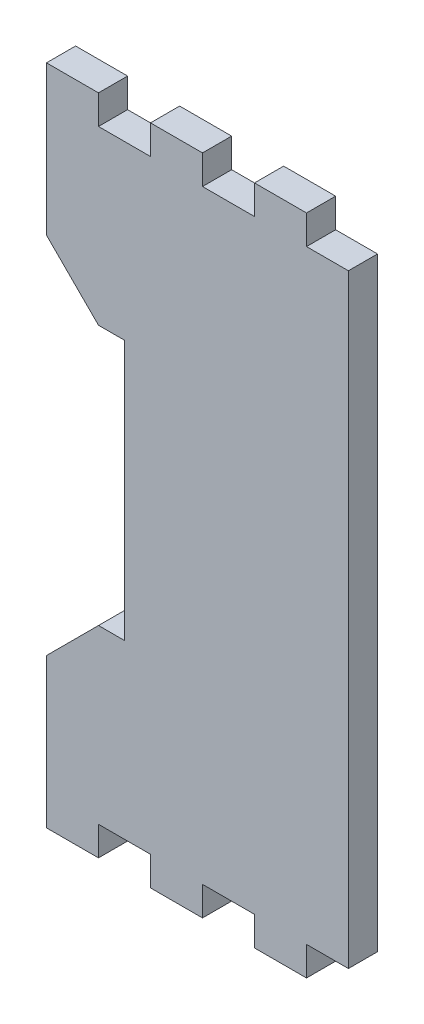
ISO-10303-21;
HEADER;
FILE_DESCRIPTION(('STEP AP214'),'2;1');
FILE_NAME('part.step','',(''),(''),'','','');
FILE_SCHEMA(('AUTOMOTIVE_DESIGN { 1 0 10303 214 1 1 1 1 }'));
ENDSEC;
DATA;
#1=APPLICATION_CONTEXT('core data for automotive mechanical design processes');
#2=APPLICATION_PROTOCOL_DEFINITION('international standard','automotive_design',2000,#1);
#3=PRODUCT_CONTEXT('',#1,'mechanical');
#4=PRODUCT('Part','Part','',(#3));
#5=PRODUCT_RELATED_PRODUCT_CATEGORY('part','',(#4));
#6=PRODUCT_DEFINITION_FORMATION('','',#4);
#7=PRODUCT_DEFINITION_CONTEXT('part definition',#1,'design');
#8=PRODUCT_DEFINITION('design','',#6,#7);
#9=PRODUCT_DEFINITION_SHAPE('','',#8);
#10=(LENGTH_UNIT() NAMED_UNIT(*) SI_UNIT(.MILLI.,.METRE.));
#11=(NAMED_UNIT(*) PLANE_ANGLE_UNIT() SI_UNIT($,.RADIAN.));
#12=(NAMED_UNIT(*) SI_UNIT($,.STERADIAN.) SOLID_ANGLE_UNIT());
#13=UNCERTAINTY_MEASURE_WITH_UNIT(LENGTH_MEASURE(1.E-05),#10,'distance_accuracy_value','');
#14=(GEOMETRIC_REPRESENTATION_CONTEXT(3) GLOBAL_UNCERTAINTY_ASSIGNED_CONTEXT((#13)) GLOBAL_UNIT_ASSIGNED_CONTEXT((#10,
#11,#12)) REPRESENTATION_CONTEXT('',''));
#15=CARTESIAN_POINT('',(0.,0.,0.));
#16=DIRECTION('',(0.,0.,1.));
#17=DIRECTION('',(1.,0.,0.));
#18=AXIS2_PLACEMENT_3D('',#15,#16,#17);
#19=CARTESIAN_POINT('',(71.2512678289992,129.093154424768,-71.1104050028954));
#20=DIRECTION('',(1.,0.,0.));
#21=DIRECTION('',(0.,1.,0.));
#22=AXIS2_PLACEMENT_3D('',#19,#20,#21);
#23=PLANE('',#22);
#24=DIRECTION('',(0.,-1.,0.));
#25=VECTOR('',#24,1.);
#26=CARTESIAN_POINT('',(71.2512678289992,129.093154424768,-76.7104050028954));
#27=LINE('',#26,#25);
#28=CARTESIAN_POINT('',(71.2512678289992,134.693154424768,-76.7104050028954));
#29=VERTEX_POINT('',#28);
#30=CARTESIAN_POINT('',(71.2512678289992,105.993154424768,-76.7104050028954));
#31=VERTEX_POINT('',#30);
#32=EDGE_CURVE('E151',#29,#31,#27,.T.);
#33=ORIENTED_EDGE('',*,*,#32,.T.);
#34=DIRECTION('',(0.,0.,-1.));
#35=VECTOR('',#34,1.);
#36=CARTESIAN_POINT('',(71.2512678289992,105.993154424768,-71.1104050028954));
#37=LINE('',#36,#35);
#38=CARTESIAN_POINT('',(71.2512678289992,105.993154424768,-71.1104050028954));
#39=VERTEX_POINT('',#38);
#40=EDGE_CURVE('E11',#39,#31,#37,.T.);
#41=ORIENTED_EDGE('',*,*,#40,.F.);
#42=DIRECTION('',(0.,-1.,0.));
#43=VECTOR('',#42,1.);
#44=CARTESIAN_POINT('',(71.2512678289992,134.693154424768,-71.1104050028954));
#45=LINE('',#44,#43);
#46=CARTESIAN_POINT('',(71.2512678289992,134.693154424768,-71.1104050028954));
#47=VERTEX_POINT('',#46);
#48=EDGE_CURVE('E157',#47,#39,#45,.T.);
#49=ORIENTED_EDGE('',*,*,#48,.F.);
#50=DIRECTION('',(0.,0.,-1.));
#51=VECTOR('',#50,1.);
#52=CARTESIAN_POINT('',(71.2512678289992,134.693154424768,-71.1104050028954));
#53=LINE('',#52,#51);
#54=EDGE_CURVE('E257',#47,#29,#53,.T.);
#55=ORIENTED_EDGE('',*,*,#54,.T.);
#56=EDGE_LOOP('',(#33,#41,#49,#55));
#57=FACE_BOUND('',#56,.T.);
#58=ADVANCED_FACE('F33',(#57),#23,.F.);
#59=CARTESIAN_POINT('',(71.2512678289992,105.993154424768,-71.1104050028954));
#60=DIRECTION('',(0.707106781186549,0.707106781186546,0.));
#61=DIRECTION('',(-0.707106781186546,0.707106781186549,0.));
#62=AXIS2_PLACEMENT_3D('',#59,#60,#61);
#63=PLANE('',#62);
#64=DIRECTION('',(0.707106781186546,-0.707106781186549,0.));
#65=VECTOR('',#64,1.);
#66=CARTESIAN_POINT('',(71.2512678289992,105.993154424768,-76.7104050028954));
#67=LINE('',#66,#65);
#68=CARTESIAN_POINT('',(81.2512678289992,95.9931544247676,-76.7104050028954));
#69=VERTEX_POINT('',#68);
#70=EDGE_CURVE('E262',#31,#69,#67,.T.);
#71=ORIENTED_EDGE('',*,*,#70,.T.);
#72=DIRECTION('',(0.,0.,-1.));
#73=VECTOR('',#72,1.);
#74=CARTESIAN_POINT('',(81.2512678289992,95.9931544247676,-71.1104050028954));
#75=LINE('',#74,#73);
#76=CARTESIAN_POINT('',(81.2512678289992,95.9931544247676,-71.1104050028954));
#77=VERTEX_POINT('',#76);
#78=EDGE_CURVE('E41',#77,#69,#75,.T.);
#79=ORIENTED_EDGE('',*,*,#78,.F.);
#80=DIRECTION('',(0.707106781186546,-0.707106781186549,0.));
#81=VECTOR('',#80,1.);
#82=CARTESIAN_POINT('',(71.2512678289992,105.993154424768,-71.1104050028954));
#83=LINE('',#82,#81);
#84=EDGE_CURVE('E477',#39,#77,#83,.T.);
#85=ORIENTED_EDGE('',*,*,#84,.F.);
#86=ORIENTED_EDGE('',*,*,#40,.T.);
#87=EDGE_LOOP('',(#71,#79,#85,#86));
#88=FACE_BOUND('',#87,.T.);
#89=ADVANCED_FACE('F480',(#88),#63,.F.);
#90=CARTESIAN_POINT('',(81.2512678289992,95.9931544247676,-71.1104050028954));
#91=DIRECTION('',(0.,1.,0.));
#92=DIRECTION('',(0.,0.,1.));
#93=AXIS2_PLACEMENT_3D('',#90,#91,#92);
#94=PLANE('',#93);
#95=DIRECTION('',(1.,0.,0.));
#96=VECTOR('',#95,1.);
#97=CARTESIAN_POINT('',(81.2512678289992,95.9931544247676,-76.7104050028954));
#98=LINE('',#97,#96);
#99=CARTESIAN_POINT('',(86.2512678289992,95.9931544247676,-76.7104050028954));
#100=VERTEX_POINT('',#99);
#101=EDGE_CURVE('E264',#69,#100,#98,.T.);
#102=ORIENTED_EDGE('',*,*,#101,.T.);
#103=DIRECTION('',(0.,0.,-1.));
#104=VECTOR('',#103,1.);
#105=CARTESIAN_POINT('',(86.2512678289992,95.9931544247676,-71.1104050028954));
#106=LINE('',#105,#104);
#107=CARTESIAN_POINT('',(86.2512678289992,95.9931544247676,-71.1104050028954));
#108=VERTEX_POINT('',#107);
#109=EDGE_CURVE('E392',#108,#100,#106,.T.);
#110=ORIENTED_EDGE('',*,*,#109,.F.);
#111=DIRECTION('',(1.,0.,0.));
#112=VECTOR('',#111,1.);
#113=CARTESIAN_POINT('',(81.2512678289992,95.9931544247676,-71.1104050028954));
#114=LINE('',#113,#112);
#115=EDGE_CURVE('E401',#77,#108,#114,.T.);
#116=ORIENTED_EDGE('',*,*,#115,.F.);
#117=ORIENTED_EDGE('',*,*,#78,.T.);
#118=EDGE_LOOP('',(#102,#110,#116,#117));
#119=FACE_BOUND('',#118,.T.);
#120=ADVANCED_FACE('F399',(#119),#94,.F.);
#121=CARTESIAN_POINT('',(86.2512678289992,95.9931544247676,-71.1104050028954));
#122=DIRECTION('',(1.,0.,0.));
#123=DIRECTION('',(0.,0.,-1.));
#124=AXIS2_PLACEMENT_3D('',#121,#122,#123);
#125=PLANE('',#124);
#126=DIRECTION('',(0.,-1.,0.));
#127=VECTOR('',#126,1.);
#128=CARTESIAN_POINT('',(86.2512678289992,95.9931544247676,-76.7104050028954));
#129=LINE('',#128,#127);
#130=CARTESIAN_POINT('',(86.2512678289992,45.9931544247676,-76.7104050028954));
#131=VERTEX_POINT('',#130);
#132=EDGE_CURVE('E266',#100,#131,#129,.T.);
#133=ORIENTED_EDGE('',*,*,#132,.T.);
#134=DIRECTION('',(0.,0.,-1.));
#135=VECTOR('',#134,1.);
#136=CARTESIAN_POINT('',(86.2512678289992,45.9931544247676,-71.1104050028954));
#137=LINE('',#136,#135);
#138=CARTESIAN_POINT('',(86.2512678289992,45.9931544247676,-71.1104050028954));
#139=VERTEX_POINT('',#138);
#140=EDGE_CURVE('E389',#139,#131,#137,.T.);
#141=ORIENTED_EDGE('',*,*,#140,.F.);
#142=DIRECTION('',(0.,-1.,0.));
#143=VECTOR('',#142,1.);
#144=CARTESIAN_POINT('',(86.2512678289992,95.9931544247676,-71.1104050028954));
#145=LINE('',#144,#143);
#146=EDGE_CURVE('E419',#108,#139,#145,.T.);
#147=ORIENTED_EDGE('',*,*,#146,.F.);
#148=ORIENTED_EDGE('',*,*,#109,.T.);
#149=EDGE_LOOP('',(#133,#141,#147,#148));
#150=FACE_BOUND('',#149,.T.);
#151=ADVANCED_FACE('F410',(#150),#125,.F.);
#152=CARTESIAN_POINT('',(86.2512678289992,45.9931544247676,-71.1104050028954));
#153=DIRECTION('',(0.,-1.,0.));
#154=DIRECTION('',(0.,0.,-1.));
#155=AXIS2_PLACEMENT_3D('',#152,#153,#154);
#156=PLANE('',#155);
#157=DIRECTION('',(-1.,0.,0.));
#158=VECTOR('',#157,1.);
#159=CARTESIAN_POINT('',(86.2512678289992,45.9931544247676,-76.7104050028954));
#160=LINE('',#159,#158);
#161=CARTESIAN_POINT('',(81.2512678289992,45.9931544247676,-76.7104050028954));
#162=VERTEX_POINT('',#161);
#163=EDGE_CURVE('E268',#131,#162,#160,.T.);
#164=ORIENTED_EDGE('',*,*,#163,.T.);
#165=DIRECTION('',(0.,0.,-1.));
#166=VECTOR('',#165,1.);
#167=CARTESIAN_POINT('',(81.2512678289992,45.9931544247676,-71.1104050028954));
#168=LINE('',#167,#166);
#169=CARTESIAN_POINT('',(81.2512678289992,45.9931544247676,-71.1104050028954));
#170=VERTEX_POINT('',#169);
#171=EDGE_CURVE('E386',#170,#162,#168,.T.);
#172=ORIENTED_EDGE('',*,*,#171,.F.);
#173=DIRECTION('',(-1.,0.,0.));
#174=VECTOR('',#173,1.);
#175=CARTESIAN_POINT('',(86.2512678289992,45.9931544247676,-71.1104050028954));
#176=LINE('',#175,#174);
#177=EDGE_CURVE('E416',#139,#170,#176,.T.);
#178=ORIENTED_EDGE('',*,*,#177,.F.);
#179=ORIENTED_EDGE('',*,*,#140,.T.);
#180=EDGE_LOOP('',(#164,#172,#178,#179));
#181=FACE_BOUND('',#180,.T.);
#182=ADVANCED_FACE('F414',(#181),#156,.F.);
#183=CARTESIAN_POINT('',(81.2512678289992,45.9931544247676,-71.1104050028954));
#184=DIRECTION('',(0.707106781186549,-0.707106781186546,0.));
#185=DIRECTION('',(0.707106781186546,0.707106781186549,0.));
#186=AXIS2_PLACEMENT_3D('',#183,#184,#185);
#187=PLANE('',#186);
#188=DIRECTION('',(-0.707106781186546,-0.707106781186549,0.));
#189=VECTOR('',#188,1.);
#190=CARTESIAN_POINT('',(81.2512678289992,45.9931544247676,-76.7104050028954));
#191=LINE('',#190,#189);
#192=CARTESIAN_POINT('',(71.2512678289992,35.9931544247676,-76.7104050028954));
#193=VERTEX_POINT('',#192);
#194=EDGE_CURVE('E270',#162,#193,#191,.T.);
#195=ORIENTED_EDGE('',*,*,#194,.T.);
#196=DIRECTION('',(0.,0.,-1.));
#197=VECTOR('',#196,1.);
#198=CARTESIAN_POINT('',(71.2512678289992,35.9931544247676,-71.1104050028954));
#199=LINE('',#198,#197);
#200=CARTESIAN_POINT('',(71.2512678289992,35.9931544247676,-71.1104050028954));
#201=VERTEX_POINT('',#200);
#202=EDGE_CURVE('E383',#201,#193,#199,.T.);
#203=ORIENTED_EDGE('',*,*,#202,.F.);
#204=DIRECTION('',(-0.707106781186546,-0.707106781186549,0.));
#205=VECTOR('',#204,1.);
#206=CARTESIAN_POINT('',(81.2512678289992,45.9931544247676,-71.1104050028954));
#207=LINE('',#206,#205);
#208=EDGE_CURVE('E418',#170,#201,#207,.T.);
#209=ORIENTED_EDGE('',*,*,#208,.F.);
#210=ORIENTED_EDGE('',*,*,#171,.T.);
#211=EDGE_LOOP('',(#195,#203,#209,#210));
#212=FACE_BOUND('',#211,.T.);
#213=ADVANCED_FACE('F492',(#212),#187,.F.);
#214=CARTESIAN_POINT('',(71.2512678289992,12.8931544247676,-71.1104050028954));
#215=DIRECTION('',(1.,0.,0.));
#216=DIRECTION('',(0.,0.,-1.));
#217=AXIS2_PLACEMENT_3D('',#214,#215,#216);
#218=PLANE('',#217);
#219=DIRECTION('',(0.,-1.,0.));
#220=VECTOR('',#219,1.);
#221=CARTESIAN_POINT('',(71.2512678289992,12.8931544247676,-76.7104050028954));
#222=LINE('',#221,#220);
#223=CARTESIAN_POINT('',(71.2512678289992,7.29315442476763,-76.7104050028954));
#224=VERTEX_POINT('',#223);
#225=EDGE_CURVE('E273',#193,#224,#222,.T.);
#226=ORIENTED_EDGE('',*,*,#225,.T.);
#227=DIRECTION('',(0.,0.,-1.));
#228=VECTOR('',#227,1.);
#229=CARTESIAN_POINT('',(71.2512678289992,7.29315442476763,-71.1104050028954));
#230=LINE('',#229,#228);
#231=CARTESIAN_POINT('',(71.2512678289992,7.29315442476763,-71.1104050028954));
#232=VERTEX_POINT('',#231);
#233=EDGE_CURVE('E380',#232,#224,#230,.T.);
#234=ORIENTED_EDGE('',*,*,#233,.F.);
#235=DIRECTION('',(0.,-1.,0.));
#236=VECTOR('',#235,1.);
#237=CARTESIAN_POINT('',(71.2512678289992,35.9931544247676,-71.1104050028954));
#238=LINE('',#237,#236);
#239=EDGE_CURVE('E421',#201,#232,#238,.T.);
#240=ORIENTED_EDGE('',*,*,#239,.F.);
#241=ORIENTED_EDGE('',*,*,#202,.T.);
#242=EDGE_LOOP('',(#226,#234,#240,#241));
#243=FACE_BOUND('',#242,.T.);
#244=ADVANCED_FACE('F495',(#243),#218,.F.);
#245=CARTESIAN_POINT('',(71.2512678289992,7.29315442476763,-71.1104050028954));
#246=DIRECTION('',(0.,1.,0.));
#247=DIRECTION('',(0.,0.,1.));
#248=AXIS2_PLACEMENT_3D('',#245,#246,#247);
#249=PLANE('',#248);
#250=DIRECTION('',(1.,0.,0.));
#251=VECTOR('',#250,1.);
#252=CARTESIAN_POINT('',(71.2512678289992,7.29315442476763,-76.7104050028954));
#253=LINE('',#252,#251);
#254=CARTESIAN_POINT('',(81.2512678289992,7.29315442476763,-76.7104050028954));
#255=VERTEX_POINT('',#254);
#256=EDGE_CURVE('E275',#224,#255,#253,.T.);
#257=ORIENTED_EDGE('',*,*,#256,.T.);
#258=DIRECTION('',(0.,0.,-1.));
#259=VECTOR('',#258,1.);
#260=CARTESIAN_POINT('',(81.2512678289992,7.29315442476763,-71.1104050028954));
#261=LINE('',#260,#259);
#262=CARTESIAN_POINT('',(81.2512678289992,7.29315442476763,-71.1104050028954));
#263=VERTEX_POINT('',#262);
#264=EDGE_CURVE('E377',#263,#255,#261,.T.);
#265=ORIENTED_EDGE('',*,*,#264,.F.);
#266=DIRECTION('',(1.,0.,0.));
#267=VECTOR('',#266,1.);
#268=CARTESIAN_POINT('',(71.2512678289992,7.29315442476763,-71.1104050028954));
#269=LINE('',#268,#267);
#270=EDGE_CURVE('E427',#232,#263,#269,.T.);
#271=ORIENTED_EDGE('',*,*,#270,.F.);
#272=ORIENTED_EDGE('',*,*,#233,.T.);
#273=EDGE_LOOP('',(#257,#265,#271,#272));
#274=FACE_BOUND('',#273,.T.);
#275=ADVANCED_FACE('F499',(#274),#249,.F.);
#276=CARTESIAN_POINT('',(81.2512678289992,7.29315442476763,-71.1104050028954));
#277=DIRECTION('',(-1.,0.,0.));
#278=DIRECTION('',(0.,0.,1.));
#279=AXIS2_PLACEMENT_3D('',#276,#277,#278);
#280=PLANE('',#279);
#281=DIRECTION('',(0.,1.,0.));
#282=VECTOR('',#281,1.);
#283=CARTESIAN_POINT('',(81.2512678289992,7.29315442476763,-76.7104050028954));
#284=LINE('',#283,#282);
#285=CARTESIAN_POINT('',(81.2512678289992,12.8931544247676,-76.7104050028954));
#286=VERTEX_POINT('',#285);
#287=EDGE_CURVE('E277',#255,#286,#284,.T.);
#288=ORIENTED_EDGE('',*,*,#287,.T.);
#289=DIRECTION('',(0.,0.,-1.));
#290=VECTOR('',#289,1.);
#291=CARTESIAN_POINT('',(81.2512678289992,12.8931544247676,-71.1104050028954));
#292=LINE('',#291,#290);
#293=CARTESIAN_POINT('',(81.2512678289992,12.8931544247676,-71.1104050028954));
#294=VERTEX_POINT('',#293);
#295=EDGE_CURVE('E374',#294,#286,#292,.T.);
#296=ORIENTED_EDGE('',*,*,#295,.F.);
#297=DIRECTION('',(0.,1.,0.));
#298=VECTOR('',#297,1.);
#299=CARTESIAN_POINT('',(81.2512678289992,7.29315442476763,-71.1104050028954));
#300=LINE('',#299,#298);
#301=EDGE_CURVE('E429',#263,#294,#300,.T.);
#302=ORIENTED_EDGE('',*,*,#301,.F.);
#303=ORIENTED_EDGE('',*,*,#264,.T.);
#304=EDGE_LOOP('',(#288,#296,#302,#303));
#305=FACE_BOUND('',#304,.T.);
#306=ADVANCED_FACE('F503',(#305),#280,.F.);
#307=CARTESIAN_POINT('',(81.2512678289992,12.8931544247676,-71.1104050028954));
#308=DIRECTION('',(0.,1.,0.));
#309=DIRECTION('',(0.,0.,1.));
#310=AXIS2_PLACEMENT_3D('',#307,#308,#309);
#311=PLANE('',#310);
#312=DIRECTION('',(1.,0.,0.));
#313=VECTOR('',#312,1.);
#314=CARTESIAN_POINT('',(81.2512678289992,12.8931544247676,-76.7104050028954));
#315=LINE('',#314,#313);
#316=CARTESIAN_POINT('',(91.2512678289992,12.8931544247676,-76.7104050028954));
#317=VERTEX_POINT('',#316);
#318=EDGE_CURVE('E279',#286,#317,#315,.T.);
#319=ORIENTED_EDGE('',*,*,#318,.T.);
#320=DIRECTION('',(0.,0.,-1.));
#321=VECTOR('',#320,1.);
#322=CARTESIAN_POINT('',(91.2512678289992,12.8931544247676,-71.1104050028954));
#323=LINE('',#322,#321);
#324=CARTESIAN_POINT('',(91.2512678289992,12.8931544247676,-71.1104050028954));
#325=VERTEX_POINT('',#324);
#326=EDGE_CURVE('E371',#325,#317,#323,.T.);
#327=ORIENTED_EDGE('',*,*,#326,.F.);
#328=DIRECTION('',(1.,0.,0.));
#329=VECTOR('',#328,1.);
#330=CARTESIAN_POINT('',(81.2512678289992,12.8931544247676,-71.1104050028954));
#331=LINE('',#330,#329);
#332=EDGE_CURVE('E431',#294,#325,#331,.T.);
#333=ORIENTED_EDGE('',*,*,#332,.F.);
#334=ORIENTED_EDGE('',*,*,#295,.T.);
#335=EDGE_LOOP('',(#319,#327,#333,#334));
#336=FACE_BOUND('',#335,.T.);
#337=ADVANCED_FACE('F507',(#336),#311,.F.);
#338=CARTESIAN_POINT('',(91.2512678289992,12.8931544247676,-71.1104050028954));
#339=DIRECTION('',(1.,0.,0.));
#340=DIRECTION('',(0.,0.,-1.));
#341=AXIS2_PLACEMENT_3D('',#338,#339,#340);
#342=PLANE('',#341);
#343=DIRECTION('',(0.,-1.,0.));
#344=VECTOR('',#343,1.);
#345=CARTESIAN_POINT('',(91.2512678289992,12.8931544247676,-76.7104050028954));
#346=LINE('',#345,#344);
#347=CARTESIAN_POINT('',(91.2512678289992,7.29315442476763,-76.7104050028954));
#348=VERTEX_POINT('',#347);
#349=EDGE_CURVE('E281',#317,#348,#346,.T.);
#350=ORIENTED_EDGE('',*,*,#349,.T.);
#351=DIRECTION('',(0.,0.,-1.));
#352=VECTOR('',#351,1.);
#353=CARTESIAN_POINT('',(91.2512678289992,7.29315442476763,-71.1104050028954));
#354=LINE('',#353,#352);
#355=CARTESIAN_POINT('',(91.2512678289992,7.29315442476763,-71.1104050028954));
#356=VERTEX_POINT('',#355);
#357=EDGE_CURVE('E368',#356,#348,#354,.T.);
#358=ORIENTED_EDGE('',*,*,#357,.F.);
#359=DIRECTION('',(0.,-1.,0.));
#360=VECTOR('',#359,1.);
#361=CARTESIAN_POINT('',(91.2512678289992,12.8931544247676,-71.1104050028954));
#362=LINE('',#361,#360);
#363=EDGE_CURVE('E433',#325,#356,#362,.T.);
#364=ORIENTED_EDGE('',*,*,#363,.F.);
#365=ORIENTED_EDGE('',*,*,#326,.T.);
#366=EDGE_LOOP('',(#350,#358,#364,#365));
#367=FACE_BOUND('',#366,.T.);
#368=ADVANCED_FACE('F511',(#367),#342,.F.);
#369=CARTESIAN_POINT('',(91.2512678289992,7.29315442476763,-71.1104050028954));
#370=DIRECTION('',(0.,1.,0.));
#371=DIRECTION('',(0.,0.,1.));
#372=AXIS2_PLACEMENT_3D('',#369,#370,#371);
#373=PLANE('',#372);
#374=DIRECTION('',(1.,0.,0.));
#375=VECTOR('',#374,1.);
#376=CARTESIAN_POINT('',(91.2512678289992,7.29315442476763,-76.7104050028954));
#377=LINE('',#376,#375);
#378=CARTESIAN_POINT('',(101.251267828999,7.29315442476763,-76.7104050028954));
#379=VERTEX_POINT('',#378);
#380=EDGE_CURVE('E283',#348,#379,#377,.T.);
#381=ORIENTED_EDGE('',*,*,#380,.T.);
#382=DIRECTION('',(0.,0.,-1.));
#383=VECTOR('',#382,1.);
#384=CARTESIAN_POINT('',(101.251267828999,7.29315442476763,-71.1104050028954));
#385=LINE('',#384,#383);
#386=CARTESIAN_POINT('',(101.251267828999,7.29315442476763,-71.1104050028954));
#387=VERTEX_POINT('',#386);
#388=EDGE_CURVE('E365',#387,#379,#385,.T.);
#389=ORIENTED_EDGE('',*,*,#388,.F.);
#390=DIRECTION('',(1.,0.,0.));
#391=VECTOR('',#390,1.);
#392=CARTESIAN_POINT('',(91.2512678289992,7.29315442476763,-71.1104050028954));
#393=LINE('',#392,#391);
#394=EDGE_CURVE('E435',#356,#387,#393,.T.);
#395=ORIENTED_EDGE('',*,*,#394,.F.);
#396=ORIENTED_EDGE('',*,*,#357,.T.);
#397=EDGE_LOOP('',(#381,#389,#395,#396));
#398=FACE_BOUND('',#397,.T.);
#399=ADVANCED_FACE('F515',(#398),#373,.F.);
#400=CARTESIAN_POINT('',(101.251267828999,7.29315442476763,-71.1104050028954));
#401=DIRECTION('',(-1.,0.,0.));
#402=DIRECTION('',(0.,0.,1.));
#403=AXIS2_PLACEMENT_3D('',#400,#401,#402);
#404=PLANE('',#403);
#405=DIRECTION('',(0.,1.,0.));
#406=VECTOR('',#405,1.);
#407=CARTESIAN_POINT('',(101.251267828999,7.29315442476763,-76.7104050028954));
#408=LINE('',#407,#406);
#409=CARTESIAN_POINT('',(101.251267828999,12.8931544247676,-76.7104050028954));
#410=VERTEX_POINT('',#409);
#411=EDGE_CURVE('E285',#379,#410,#408,.T.);
#412=ORIENTED_EDGE('',*,*,#411,.T.);
#413=DIRECTION('',(0.,0.,-1.));
#414=VECTOR('',#413,1.);
#415=CARTESIAN_POINT('',(101.251267828999,12.8931544247676,-71.1104050028954));
#416=LINE('',#415,#414);
#417=CARTESIAN_POINT('',(101.251267828999,12.8931544247676,-71.1104050028954));
#418=VERTEX_POINT('',#417);
#419=EDGE_CURVE('E362',#418,#410,#416,.T.);
#420=ORIENTED_EDGE('',*,*,#419,.F.);
#421=DIRECTION('',(0.,1.,0.));
#422=VECTOR('',#421,1.);
#423=CARTESIAN_POINT('',(101.251267828999,7.29315442476763,-71.1104050028954));
#424=LINE('',#423,#422);
#425=EDGE_CURVE('E437',#387,#418,#424,.T.);
#426=ORIENTED_EDGE('',*,*,#425,.F.);
#427=ORIENTED_EDGE('',*,*,#388,.T.);
#428=EDGE_LOOP('',(#412,#420,#426,#427));
#429=FACE_BOUND('',#428,.T.);
#430=ADVANCED_FACE('F519',(#429),#404,.F.);
#431=CARTESIAN_POINT('',(101.251267828999,12.8931544247676,-71.1104050028954));
#432=DIRECTION('',(0.,1.,0.));
#433=DIRECTION('',(0.,0.,1.));
#434=AXIS2_PLACEMENT_3D('',#431,#432,#433);
#435=PLANE('',#434);
#436=DIRECTION('',(1.,0.,0.));
#437=VECTOR('',#436,1.);
#438=CARTESIAN_POINT('',(101.251267828999,12.8931544247676,-76.7104050028954));
#439=LINE('',#438,#437);
#440=CARTESIAN_POINT('',(111.251267828999,12.8931544247676,-76.7104050028954));
#441=VERTEX_POINT('',#440);
#442=EDGE_CURVE('E287',#410,#441,#439,.T.);
#443=ORIENTED_EDGE('',*,*,#442,.T.);
#444=DIRECTION('',(0.,0.,-1.));
#445=VECTOR('',#444,1.);
#446=CARTESIAN_POINT('',(111.251267828999,12.8931544247676,-71.1104050028954));
#447=LINE('',#446,#445);
#448=CARTESIAN_POINT('',(111.251267828999,12.8931544247676,-71.1104050028954));
#449=VERTEX_POINT('',#448);
#450=EDGE_CURVE('E359',#449,#441,#447,.T.);
#451=ORIENTED_EDGE('',*,*,#450,.F.);
#452=DIRECTION('',(1.,0.,0.));
#453=VECTOR('',#452,1.);
#454=CARTESIAN_POINT('',(101.251267828999,12.8931544247676,-71.1104050028954));
#455=LINE('',#454,#453);
#456=EDGE_CURVE('E439',#418,#449,#455,.T.);
#457=ORIENTED_EDGE('',*,*,#456,.F.);
#458=ORIENTED_EDGE('',*,*,#419,.T.);
#459=EDGE_LOOP('',(#443,#451,#457,#458));
#460=FACE_BOUND('',#459,.T.);
#461=ADVANCED_FACE('F523',(#460),#435,.F.);
#462=CARTESIAN_POINT('',(111.251267828999,12.8931544247676,-71.1104050028954));
#463=DIRECTION('',(1.,0.,0.));
#464=DIRECTION('',(0.,0.,-1.));
#465=AXIS2_PLACEMENT_3D('',#462,#463,#464);
#466=PLANE('',#465);
#467=DIRECTION('',(0.,-1.,0.));
#468=VECTOR('',#467,1.);
#469=CARTESIAN_POINT('',(111.251267828999,12.8931544247676,-76.7104050028954));
#470=LINE('',#469,#468);
#471=CARTESIAN_POINT('',(111.251267828999,7.29315442476763,-76.7104050028954));
#472=VERTEX_POINT('',#471);
#473=EDGE_CURVE('E289',#441,#472,#470,.T.);
#474=ORIENTED_EDGE('',*,*,#473,.T.);
#475=DIRECTION('',(0.,0.,-1.));
#476=VECTOR('',#475,1.);
#477=CARTESIAN_POINT('',(111.251267828999,7.29315442476763,-71.1104050028954));
#478=LINE('',#477,#476);
#479=CARTESIAN_POINT('',(111.251267828999,7.29315442476763,-71.1104050028954));
#480=VERTEX_POINT('',#479);
#481=EDGE_CURVE('E356',#480,#472,#478,.T.);
#482=ORIENTED_EDGE('',*,*,#481,.F.);
#483=DIRECTION('',(0.,-1.,0.));
#484=VECTOR('',#483,1.);
#485=CARTESIAN_POINT('',(111.251267828999,12.8931544247676,-71.1104050028954));
#486=LINE('',#485,#484);
#487=EDGE_CURVE('E441',#449,#480,#486,.T.);
#488=ORIENTED_EDGE('',*,*,#487,.F.);
#489=ORIENTED_EDGE('',*,*,#450,.T.);
#490=EDGE_LOOP('',(#474,#482,#488,#489));
#491=FACE_BOUND('',#490,.T.);
#492=ADVANCED_FACE('F527',(#491),#466,.F.);
#493=CARTESIAN_POINT('',(111.251267828999,7.29315442476763,-71.1104050028954));
#494=DIRECTION('',(0.,1.,0.));
#495=DIRECTION('',(0.,0.,1.));
#496=AXIS2_PLACEMENT_3D('',#493,#494,#495);
#497=PLANE('',#496);
#498=DIRECTION('',(1.,0.,0.));
#499=VECTOR('',#498,1.);
#500=CARTESIAN_POINT('',(111.251267828999,7.29315442476763,-76.7104050028954));
#501=LINE('',#500,#499);
#502=CARTESIAN_POINT('',(121.251267828999,7.29315442476763,-76.7104050028954));
#503=VERTEX_POINT('',#502);
#504=EDGE_CURVE('E291',#472,#503,#501,.T.);
#505=ORIENTED_EDGE('',*,*,#504,.T.);
#506=DIRECTION('',(0.,0.,-1.));
#507=VECTOR('',#506,1.);
#508=CARTESIAN_POINT('',(121.251267828999,7.29315442476763,-71.1104050028954));
#509=LINE('',#508,#507);
#510=CARTESIAN_POINT('',(121.251267828999,7.29315442476763,-71.1104050028954));
#511=VERTEX_POINT('',#510);
#512=EDGE_CURVE('E353',#511,#503,#509,.T.);
#513=ORIENTED_EDGE('',*,*,#512,.F.);
#514=DIRECTION('',(1.,0.,0.));
#515=VECTOR('',#514,1.);
#516=CARTESIAN_POINT('',(111.251267828999,7.29315442476763,-71.1104050028954));
#517=LINE('',#516,#515);
#518=EDGE_CURVE('E443',#480,#511,#517,.T.);
#519=ORIENTED_EDGE('',*,*,#518,.F.);
#520=ORIENTED_EDGE('',*,*,#481,.T.);
#521=EDGE_LOOP('',(#505,#513,#519,#520));
#522=FACE_BOUND('',#521,.T.);
#523=ADVANCED_FACE('F531',(#522),#497,.F.);
#524=CARTESIAN_POINT('',(121.251267828999,7.29315442476763,-71.1104050028954));
#525=DIRECTION('',(-1.,0.,0.));
#526=DIRECTION('',(0.,0.,1.));
#527=AXIS2_PLACEMENT_3D('',#524,#525,#526);
#528=PLANE('',#527);
#529=DIRECTION('',(0.,1.,0.));
#530=VECTOR('',#529,1.);
#531=CARTESIAN_POINT('',(121.251267828999,7.29315442476763,-76.7104050028954));
#532=LINE('',#531,#530);
#533=CARTESIAN_POINT('',(121.251267828999,12.8931544247676,-76.7104050028954));
#534=VERTEX_POINT('',#533);
#535=EDGE_CURVE('E293',#503,#534,#532,.T.);
#536=ORIENTED_EDGE('',*,*,#535,.T.);
#537=DIRECTION('',(0.,0.,-1.));
#538=VECTOR('',#537,1.);
#539=CARTESIAN_POINT('',(121.251267828999,12.8931544247676,-71.1104050028954));
#540=LINE('',#539,#538);
#541=CARTESIAN_POINT('',(121.251267828999,12.8931544247676,-71.1104050028954));
#542=VERTEX_POINT('',#541);
#543=EDGE_CURVE('E350',#542,#534,#540,.T.);
#544=ORIENTED_EDGE('',*,*,#543,.F.);
#545=DIRECTION('',(0.,1.,0.));
#546=VECTOR('',#545,1.);
#547=CARTESIAN_POINT('',(121.251267828999,7.29315442476763,-71.1104050028954));
#548=LINE('',#547,#546);
#549=EDGE_CURVE('E445',#511,#542,#548,.T.);
#550=ORIENTED_EDGE('',*,*,#549,.F.);
#551=ORIENTED_EDGE('',*,*,#512,.T.);
#552=EDGE_LOOP('',(#536,#544,#550,#551));
#553=FACE_BOUND('',#552,.T.);
#554=ADVANCED_FACE('F535',(#553),#528,.F.);
#555=CARTESIAN_POINT('',(121.251267828999,12.8931544247676,-71.1104050028954));
#556=DIRECTION('',(0.,1.,0.));
#557=DIRECTION('',(0.,0.,1.));
#558=AXIS2_PLACEMENT_3D('',#555,#556,#557);
#559=PLANE('',#558);
#560=DIRECTION('',(1.,0.,0.));
#561=VECTOR('',#560,1.);
#562=CARTESIAN_POINT('',(121.251267828999,12.8931544247676,-76.7104050028954));
#563=LINE('',#562,#561);
#564=CARTESIAN_POINT('',(129.305687175353,12.8931544247676,-76.7104050028954));
#565=VERTEX_POINT('',#564);
#566=EDGE_CURVE('E295',#534,#565,#563,.T.);
#567=ORIENTED_EDGE('',*,*,#566,.T.);
#568=DIRECTION('',(0.,0.,-1.));
#569=VECTOR('',#568,1.);
#570=CARTESIAN_POINT('',(129.305687175353,12.8931544247676,-71.1104050028954));
#571=LINE('',#570,#569);
#572=CARTESIAN_POINT('',(129.305687175353,12.8931544247676,-71.1104050028954));
#573=VERTEX_POINT('',#572);
#574=EDGE_CURVE('E347',#573,#565,#571,.T.);
#575=ORIENTED_EDGE('',*,*,#574,.F.);
#576=DIRECTION('',(1.,0.,0.));
#577=VECTOR('',#576,1.);
#578=CARTESIAN_POINT('',(121.251267828999,12.8931544247676,-71.1104050028954));
#579=LINE('',#578,#577);
#580=EDGE_CURVE('E447',#542,#573,#579,.T.);
#581=ORIENTED_EDGE('',*,*,#580,.F.);
#582=ORIENTED_EDGE('',*,*,#543,.T.);
#583=EDGE_LOOP('',(#567,#575,#581,#582));
#584=FACE_BOUND('',#583,.T.);
#585=ADVANCED_FACE('F539',(#584),#559,.F.);
#586=CARTESIAN_POINT('',(129.305687175353,129.093154424768,-71.1104050028954));
#587=DIRECTION('',(-1.,0.,0.));
#588=DIRECTION('',(0.,0.,1.));
#589=AXIS2_PLACEMENT_3D('',#586,#587,#588);
#590=PLANE('',#589);
#591=DIRECTION('',(0.,1.,0.));
#592=VECTOR('',#591,1.);
#593=CARTESIAN_POINT('',(129.305687175353,129.093154424768,-76.7104050028954));
#594=LINE('',#593,#592);
#595=CARTESIAN_POINT('',(129.305687175353,129.093154424768,-76.7104050028954));
#596=VERTEX_POINT('',#595);
#597=EDGE_CURVE('E297',#565,#596,#594,.T.);
#598=ORIENTED_EDGE('',*,*,#597,.T.);
#599=DIRECTION('',(0.,0.,-1.));
#600=VECTOR('',#599,1.);
#601=CARTESIAN_POINT('',(129.305687175353,129.093154424768,-71.1104050028954));
#602=LINE('',#601,#600);
#603=CARTESIAN_POINT('',(129.305687175353,129.093154424768,-71.1104050028954));
#604=VERTEX_POINT('',#603);
#605=EDGE_CURVE('E344',#604,#596,#602,.T.);
#606=ORIENTED_EDGE('',*,*,#605,.F.);
#607=DIRECTION('',(0.,1.,0.));
#608=VECTOR('',#607,1.);
#609=CARTESIAN_POINT('',(129.305687175353,129.093154424768,-71.1104050028954));
#610=LINE('',#609,#608);
#611=EDGE_CURVE('E449',#573,#604,#610,.T.);
#612=ORIENTED_EDGE('',*,*,#611,.F.);
#613=ORIENTED_EDGE('',*,*,#574,.T.);
#614=EDGE_LOOP('',(#598,#606,#612,#613));
#615=FACE_BOUND('',#614,.T.);
#616=ADVANCED_FACE('F543',(#615),#590,.F.);
#617=CARTESIAN_POINT('',(121.251267828999,129.093154424768,-71.1104050028954));
#618=DIRECTION('',(0.,-1.,0.));
#619=DIRECTION('',(0.,0.,-1.));
#620=AXIS2_PLACEMENT_3D('',#617,#618,#619);
#621=PLANE('',#620);
#622=DIRECTION('',(-1.,0.,0.));
#623=VECTOR('',#622,1.);
#624=CARTESIAN_POINT('',(121.251267828999,129.093154424768,-76.7104050028954));
#625=LINE('',#624,#623);
#626=CARTESIAN_POINT('',(121.251267828999,129.093154424768,-76.7104050028954));
#627=VERTEX_POINT('',#626);
#628=EDGE_CURVE('E299',#596,#627,#625,.T.);
#629=ORIENTED_EDGE('',*,*,#628,.T.);
#630=DIRECTION('',(0.,0.,-1.));
#631=VECTOR('',#630,1.);
#632=CARTESIAN_POINT('',(121.251267828999,129.093154424768,-71.1104050028954));
#633=LINE('',#632,#631);
#634=CARTESIAN_POINT('',(121.251267828999,129.093154424768,-71.1104050028954));
#635=VERTEX_POINT('',#634);
#636=EDGE_CURVE('E341',#635,#627,#633,.T.);
#637=ORIENTED_EDGE('',*,*,#636,.F.);
#638=DIRECTION('',(-1.,0.,0.));
#639=VECTOR('',#638,1.);
#640=CARTESIAN_POINT('',(121.251267828999,129.093154424768,-71.1104050028954));
#641=LINE('',#640,#639);
#642=EDGE_CURVE('E451',#604,#635,#641,.T.);
#643=ORIENTED_EDGE('',*,*,#642,.F.);
#644=ORIENTED_EDGE('',*,*,#605,.T.);
#645=EDGE_LOOP('',(#629,#637,#643,#644));
#646=FACE_BOUND('',#645,.T.);
#647=ADVANCED_FACE('F547',(#646),#621,.F.);
#648=CARTESIAN_POINT('',(121.251267828999,129.093154424768,-71.1104050028954));
#649=DIRECTION('',(-1.,0.,0.));
#650=DIRECTION('',(0.,0.,1.));
#651=AXIS2_PLACEMENT_3D('',#648,#649,#650);
#652=PLANE('',#651);
#653=DIRECTION('',(0.,1.,0.));
#654=VECTOR('',#653,1.);
#655=CARTESIAN_POINT('',(121.251267828999,129.093154424768,-76.7104050028954));
#656=LINE('',#655,#654);
#657=CARTESIAN_POINT('',(121.251267828999,134.693154424768,-76.7104050028954));
#658=VERTEX_POINT('',#657);
#659=EDGE_CURVE('E301',#627,#658,#656,.T.);
#660=ORIENTED_EDGE('',*,*,#659,.T.);
#661=DIRECTION('',(0.,0.,-1.));
#662=VECTOR('',#661,1.);
#663=CARTESIAN_POINT('',(121.251267828999,134.693154424768,-71.1104050028954));
#664=LINE('',#663,#662);
#665=CARTESIAN_POINT('',(121.251267828999,134.693154424768,-71.1104050028954));
#666=VERTEX_POINT('',#665);
#667=EDGE_CURVE('E338',#666,#658,#664,.T.);
#668=ORIENTED_EDGE('',*,*,#667,.F.);
#669=DIRECTION('',(0.,1.,0.));
#670=VECTOR('',#669,1.);
#671=CARTESIAN_POINT('',(121.251267828999,129.093154424768,-71.1104050028954));
#672=LINE('',#671,#670);
#673=EDGE_CURVE('E453',#635,#666,#672,.T.);
#674=ORIENTED_EDGE('',*,*,#673,.F.);
#675=ORIENTED_EDGE('',*,*,#636,.T.);
#676=EDGE_LOOP('',(#660,#668,#674,#675));
#677=FACE_BOUND('',#676,.T.);
#678=ADVANCED_FACE('F551',(#677),#652,.F.);
#679=CARTESIAN_POINT('',(121.251267828999,134.693154424768,-71.1104050028954));
#680=DIRECTION('',(0.,-1.,0.));
#681=DIRECTION('',(0.,0.,-1.));
#682=AXIS2_PLACEMENT_3D('',#679,#680,#681);
#683=PLANE('',#682);
#684=DIRECTION('',(-1.,0.,0.));
#685=VECTOR('',#684,1.);
#686=CARTESIAN_POINT('',(121.251267828999,134.693154424768,-76.7104050028954));
#687=LINE('',#686,#685);
#688=CARTESIAN_POINT('',(111.251267828999,134.693154424768,-76.7104050028954));
#689=VERTEX_POINT('',#688);
#690=EDGE_CURVE('E303',#658,#689,#687,.T.);
#691=ORIENTED_EDGE('',*,*,#690,.T.);
#692=DIRECTION('',(0.,0.,-1.));
#693=VECTOR('',#692,1.);
#694=CARTESIAN_POINT('',(111.251267828999,134.693154424768,-71.1104050028954));
#695=LINE('',#694,#693);
#696=CARTESIAN_POINT('',(111.251267828999,134.693154424768,-71.1104050028954));
#697=VERTEX_POINT('',#696);
#698=EDGE_CURVE('E335',#697,#689,#695,.T.);
#699=ORIENTED_EDGE('',*,*,#698,.F.);
#700=DIRECTION('',(-1.,0.,0.));
#701=VECTOR('',#700,1.);
#702=CARTESIAN_POINT('',(121.251267828999,134.693154424768,-71.1104050028954));
#703=LINE('',#702,#701);
#704=EDGE_CURVE('E455',#666,#697,#703,.T.);
#705=ORIENTED_EDGE('',*,*,#704,.F.);
#706=ORIENTED_EDGE('',*,*,#667,.T.);
#707=EDGE_LOOP('',(#691,#699,#705,#706));
#708=FACE_BOUND('',#707,.T.);
#709=ADVANCED_FACE('F555',(#708),#683,.F.);
#710=CARTESIAN_POINT('',(111.251267828999,134.693154424768,-71.1104050028954));
#711=DIRECTION('',(1.,0.,0.));
#712=DIRECTION('',(0.,0.,-1.));
#713=AXIS2_PLACEMENT_3D('',#710,#711,#712);
#714=PLANE('',#713);
#715=DIRECTION('',(0.,-1.,0.));
#716=VECTOR('',#715,1.);
#717=CARTESIAN_POINT('',(111.251267828999,134.693154424768,-76.7104050028954));
#718=LINE('',#717,#716);
#719=CARTESIAN_POINT('',(111.251267828999,129.093154424768,-76.7104050028954));
#720=VERTEX_POINT('',#719);
#721=EDGE_CURVE('E305',#689,#720,#718,.T.);
#722=ORIENTED_EDGE('',*,*,#721,.T.);
#723=DIRECTION('',(0.,0.,-1.));
#724=VECTOR('',#723,1.);
#725=CARTESIAN_POINT('',(111.251267828999,129.093154424768,-71.1104050028954));
#726=LINE('',#725,#724);
#727=CARTESIAN_POINT('',(111.251267828999,129.093154424768,-71.1104050028954));
#728=VERTEX_POINT('',#727);
#729=EDGE_CURVE('E332',#728,#720,#726,.T.);
#730=ORIENTED_EDGE('',*,*,#729,.F.);
#731=DIRECTION('',(0.,-1.,0.));
#732=VECTOR('',#731,1.);
#733=CARTESIAN_POINT('',(111.251267828999,134.693154424768,-71.1104050028954));
#734=LINE('',#733,#732);
#735=EDGE_CURVE('E457',#697,#728,#734,.T.);
#736=ORIENTED_EDGE('',*,*,#735,.F.);
#737=ORIENTED_EDGE('',*,*,#698,.T.);
#738=EDGE_LOOP('',(#722,#730,#736,#737));
#739=FACE_BOUND('',#738,.T.);
#740=ADVANCED_FACE('F559',(#739),#714,.F.);
#741=CARTESIAN_POINT('',(101.251267828999,129.093154424768,-71.1104050028954));
#742=DIRECTION('',(0.,-1.,0.));
#743=DIRECTION('',(0.,0.,-1.));
#744=AXIS2_PLACEMENT_3D('',#741,#742,#743);
#745=PLANE('',#744);
#746=DIRECTION('',(-1.,0.,0.));
#747=VECTOR('',#746,1.);
#748=CARTESIAN_POINT('',(101.251267828999,129.093154424768,-76.7104050028954));
#749=LINE('',#748,#747);
#750=CARTESIAN_POINT('',(101.251267828999,129.093154424768,-76.7104050028954));
#751=VERTEX_POINT('',#750);
#752=EDGE_CURVE('E307',#720,#751,#749,.T.);
#753=ORIENTED_EDGE('',*,*,#752,.T.);
#754=DIRECTION('',(0.,0.,-1.));
#755=VECTOR('',#754,1.);
#756=CARTESIAN_POINT('',(101.251267828999,129.093154424768,-71.1104050028954));
#757=LINE('',#756,#755);
#758=CARTESIAN_POINT('',(101.251267828999,129.093154424768,-71.1104050028954));
#759=VERTEX_POINT('',#758);
#760=EDGE_CURVE('E329',#759,#751,#757,.T.);
#761=ORIENTED_EDGE('',*,*,#760,.F.);
#762=DIRECTION('',(-1.,0.,0.));
#763=VECTOR('',#762,1.);
#764=CARTESIAN_POINT('',(101.251267828999,129.093154424768,-71.1104050028954));
#765=LINE('',#764,#763);
#766=EDGE_CURVE('E459',#728,#759,#765,.T.);
#767=ORIENTED_EDGE('',*,*,#766,.F.);
#768=ORIENTED_EDGE('',*,*,#729,.T.);
#769=EDGE_LOOP('',(#753,#761,#767,#768));
#770=FACE_BOUND('',#769,.T.);
#771=ADVANCED_FACE('F563',(#770),#745,.F.);
#772=CARTESIAN_POINT('',(101.251267828999,129.093154424768,-71.1104050028954));
#773=DIRECTION('',(-1.,0.,0.));
#774=DIRECTION('',(0.,0.,1.));
#775=AXIS2_PLACEMENT_3D('',#772,#773,#774);
#776=PLANE('',#775);
#777=DIRECTION('',(0.,1.,0.));
#778=VECTOR('',#777,1.);
#779=CARTESIAN_POINT('',(101.251267828999,129.093154424768,-76.7104050028954));
#780=LINE('',#779,#778);
#781=CARTESIAN_POINT('',(101.251267828999,134.693154424768,-76.7104050028954));
#782=VERTEX_POINT('',#781);
#783=EDGE_CURVE('E309',#751,#782,#780,.T.);
#784=ORIENTED_EDGE('',*,*,#783,.T.);
#785=DIRECTION('',(0.,0.,-1.));
#786=VECTOR('',#785,1.);
#787=CARTESIAN_POINT('',(101.251267828999,134.693154424768,-71.1104050028954));
#788=LINE('',#787,#786);
#789=CARTESIAN_POINT('',(101.251267828999,134.693154424768,-71.1104050028954));
#790=VERTEX_POINT('',#789);
#791=EDGE_CURVE('E326',#790,#782,#788,.T.);
#792=ORIENTED_EDGE('',*,*,#791,.F.);
#793=DIRECTION('',(0.,1.,0.));
#794=VECTOR('',#793,1.);
#795=CARTESIAN_POINT('',(101.251267828999,129.093154424768,-71.1104050028954));
#796=LINE('',#795,#794);
#797=EDGE_CURVE('E461',#759,#790,#796,.T.);
#798=ORIENTED_EDGE('',*,*,#797,.F.);
#799=ORIENTED_EDGE('',*,*,#760,.T.);
#800=EDGE_LOOP('',(#784,#792,#798,#799));
#801=FACE_BOUND('',#800,.T.);
#802=ADVANCED_FACE('F567',(#801),#776,.F.);
#803=CARTESIAN_POINT('',(101.251267828999,134.693154424768,-71.1104050028954));
#804=DIRECTION('',(0.,-1.,0.));
#805=DIRECTION('',(0.,0.,-1.));
#806=AXIS2_PLACEMENT_3D('',#803,#804,#805);
#807=PLANE('',#806);
#808=DIRECTION('',(-1.,0.,0.));
#809=VECTOR('',#808,1.);
#810=CARTESIAN_POINT('',(101.251267828999,134.693154424768,-76.7104050028954));
#811=LINE('',#810,#809);
#812=CARTESIAN_POINT('',(91.2512678289992,134.693154424768,-76.7104050028954));
#813=VERTEX_POINT('',#812);
#814=EDGE_CURVE('E311',#782,#813,#811,.T.);
#815=ORIENTED_EDGE('',*,*,#814,.T.);
#816=DIRECTION('',(0.,0.,-1.));
#817=VECTOR('',#816,1.);
#818=CARTESIAN_POINT('',(91.2512678289992,134.693154424768,-71.1104050028954));
#819=LINE('',#818,#817);
#820=CARTESIAN_POINT('',(91.2512678289992,134.693154424768,-71.1104050028954));
#821=VERTEX_POINT('',#820);
#822=EDGE_CURVE('E323',#821,#813,#819,.T.);
#823=ORIENTED_EDGE('',*,*,#822,.F.);
#824=DIRECTION('',(-1.,0.,0.));
#825=VECTOR('',#824,1.);
#826=CARTESIAN_POINT('',(101.251267828999,134.693154424768,-71.1104050028954));
#827=LINE('',#826,#825);
#828=EDGE_CURVE('E463',#790,#821,#827,.T.);
#829=ORIENTED_EDGE('',*,*,#828,.F.);
#830=ORIENTED_EDGE('',*,*,#791,.T.);
#831=EDGE_LOOP('',(#815,#823,#829,#830));
#832=FACE_BOUND('',#831,.T.);
#833=ADVANCED_FACE('F469',(#832),#807,.F.);
#834=CARTESIAN_POINT('',(91.2512678289992,134.693154424768,-71.1104050028954));
#835=DIRECTION('',(1.,0.,0.));
#836=DIRECTION('',(0.,0.,-1.));
#837=AXIS2_PLACEMENT_3D('',#834,#835,#836);
#838=PLANE('',#837);
#839=DIRECTION('',(0.,-1.,0.));
#840=VECTOR('',#839,1.);
#841=CARTESIAN_POINT('',(91.2512678289992,134.693154424768,-76.7104050028954));
#842=LINE('',#841,#840);
#843=CARTESIAN_POINT('',(91.2512678289992,129.093154424768,-76.7104050028954));
#844=VERTEX_POINT('',#843);
#845=EDGE_CURVE('E313',#813,#844,#842,.T.);
#846=ORIENTED_EDGE('',*,*,#845,.T.);
#847=DIRECTION('',(0.,0.,-1.));
#848=VECTOR('',#847,1.);
#849=CARTESIAN_POINT('',(91.2512678289992,129.093154424768,-71.1104050028954));
#850=LINE('',#849,#848);
#851=CARTESIAN_POINT('',(91.2512678289992,129.093154424768,-71.1104050028954));
#852=VERTEX_POINT('',#851);
#853=EDGE_CURVE('E252',#852,#844,#850,.T.);
#854=ORIENTED_EDGE('',*,*,#853,.F.);
#855=DIRECTION('',(0.,-1.,0.));
#856=VECTOR('',#855,1.);
#857=CARTESIAN_POINT('',(91.2512678289992,134.693154424768,-71.1104050028954));
#858=LINE('',#857,#856);
#859=EDGE_CURVE('E243',#821,#852,#858,.T.);
#860=ORIENTED_EDGE('',*,*,#859,.F.);
#861=ORIENTED_EDGE('',*,*,#822,.T.);
#862=EDGE_LOOP('',(#846,#854,#860,#861));
#863=FACE_BOUND('',#862,.T.);
#864=ADVANCED_FACE('F473',(#863),#838,.F.);
#865=CARTESIAN_POINT('',(81.2512678289992,129.093154424768,-71.1104050028954));
#866=DIRECTION('',(0.,-1.,0.));
#867=DIRECTION('',(0.,0.,-1.));
#868=AXIS2_PLACEMENT_3D('',#865,#866,#867);
#869=PLANE('',#868);
#870=DIRECTION('',(-1.,0.,0.));
#871=VECTOR('',#870,1.);
#872=CARTESIAN_POINT('',(81.2512678289992,129.093154424768,-76.7104050028954));
#873=LINE('',#872,#871);
#874=CARTESIAN_POINT('',(81.2512678289992,129.093154424768,-76.7104050028954));
#875=VERTEX_POINT('',#874);
#876=EDGE_CURVE('E251',#844,#875,#873,.T.);
#877=ORIENTED_EDGE('',*,*,#876,.T.);
#878=DIRECTION('',(0.,0.,-1.));
#879=VECTOR('',#878,1.);
#880=CARTESIAN_POINT('',(81.2512678289992,129.093154424768,-71.1104050028954));
#881=LINE('',#880,#879);
#882=CARTESIAN_POINT('',(81.2512678289992,129.093154424768,-71.1104050028954));
#883=VERTEX_POINT('',#882);
#884=EDGE_CURVE('E248',#883,#875,#881,.T.);
#885=ORIENTED_EDGE('',*,*,#884,.F.);
#886=DIRECTION('',(-1.,0.,0.));
#887=VECTOR('',#886,1.);
#888=CARTESIAN_POINT('',(81.2512678289992,129.093154424768,-71.1104050028954));
#889=LINE('',#888,#887);
#890=EDGE_CURVE('E237',#852,#883,#889,.T.);
#891=ORIENTED_EDGE('',*,*,#890,.F.);
#892=ORIENTED_EDGE('',*,*,#853,.T.);
#893=EDGE_LOOP('',(#877,#885,#891,#892));
#894=FACE_BOUND('',#893,.T.);
#895=ADVANCED_FACE('F249',(#894),#869,.F.);
#896=CARTESIAN_POINT('',(81.2512678289992,129.093154424768,-71.1104050028954));
#897=DIRECTION('',(-1.,0.,0.));
#898=DIRECTION('',(0.,0.,1.));
#899=AXIS2_PLACEMENT_3D('',#896,#897,#898);
#900=PLANE('',#899);
#901=DIRECTION('',(0.,1.,0.));
#902=VECTOR('',#901,1.);
#903=CARTESIAN_POINT('',(81.2512678289992,129.093154424768,-76.7104050028954));
#904=LINE('',#903,#902);
#905=CARTESIAN_POINT('',(81.2512678289992,134.693154424768,-76.7104050028954));
#906=VERTEX_POINT('',#905);
#907=EDGE_CURVE('E144',#875,#906,#904,.T.);
#908=ORIENTED_EDGE('',*,*,#907,.T.);
#909=DIRECTION('',(0.,0.,-1.));
#910=VECTOR('',#909,1.);
#911=CARTESIAN_POINT('',(81.2512678289992,134.693154424768,-71.1104050028954));
#912=LINE('',#911,#910);
#913=CARTESIAN_POINT('',(81.2512678289992,134.693154424768,-71.1104050028954));
#914=VERTEX_POINT('',#913);
#915=EDGE_CURVE('E253',#914,#906,#912,.T.);
#916=ORIENTED_EDGE('',*,*,#915,.F.);
#917=DIRECTION('',(0.,1.,0.));
#918=VECTOR('',#917,1.);
#919=CARTESIAN_POINT('',(81.2512678289992,129.093154424768,-71.1104050028954));
#920=LINE('',#919,#918);
#921=EDGE_CURVE('E241',#883,#914,#920,.T.);
#922=ORIENTED_EDGE('',*,*,#921,.F.);
#923=ORIENTED_EDGE('',*,*,#884,.T.);
#924=EDGE_LOOP('',(#908,#916,#922,#923));
#925=FACE_BOUND('',#924,.T.);
#926=ADVANCED_FACE('F255',(#925),#900,.F.);
#927=CARTESIAN_POINT('',(81.2512678289992,134.693154424768,-71.1104050028954));
#928=DIRECTION('',(0.,-1.,0.));
#929=DIRECTION('',(0.,0.,-1.));
#930=AXIS2_PLACEMENT_3D('',#927,#928,#929);
#931=PLANE('',#930);
#932=DIRECTION('',(-1.,0.,0.));
#933=VECTOR('',#932,1.);
#934=CARTESIAN_POINT('',(81.2512678289992,134.693154424768,-76.7104050028954));
#935=LINE('',#934,#933);
#936=EDGE_CURVE('E317',#906,#29,#935,.T.);
#937=ORIENTED_EDGE('',*,*,#936,.T.);
#938=ORIENTED_EDGE('',*,*,#54,.F.);
#939=DIRECTION('',(-1.,0.,0.));
#940=VECTOR('',#939,1.);
#941=CARTESIAN_POINT('',(81.2512678289992,134.693154424768,-71.1104050028954));
#942=LINE('',#941,#940);
#943=EDGE_CURVE('E49',#914,#47,#942,.T.);
#944=ORIENTED_EDGE('',*,*,#943,.F.);
#945=ORIENTED_EDGE('',*,*,#915,.T.);
#946=EDGE_LOOP('',(#937,#938,#944,#945));
#947=FACE_BOUND('',#946,.T.);
#948=ADVANCED_FACE('F475',(#947),#931,.F.);
#949=CARTESIAN_POINT('',(0.,0.,-71.1104050028954));
#950=DIRECTION('',(0.,0.,1.));
#951=DIRECTION('',(1.,0.,0.));
#952=AXIS2_PLACEMENT_3D('',#949,#950,#951);
#953=PLANE('',#952);
#954=ORIENTED_EDGE('',*,*,#48,.T.);
#955=ORIENTED_EDGE('',*,*,#84,.T.);
#956=ORIENTED_EDGE('',*,*,#115,.T.);
#957=ORIENTED_EDGE('',*,*,#146,.T.);
#958=ORIENTED_EDGE('',*,*,#177,.T.);
#959=ORIENTED_EDGE('',*,*,#208,.T.);
#960=ORIENTED_EDGE('',*,*,#239,.T.);
#961=ORIENTED_EDGE('',*,*,#270,.T.);
#962=ORIENTED_EDGE('',*,*,#301,.T.);
#963=ORIENTED_EDGE('',*,*,#332,.T.);
#964=ORIENTED_EDGE('',*,*,#363,.T.);
#965=ORIENTED_EDGE('',*,*,#394,.T.);
#966=ORIENTED_EDGE('',*,*,#425,.T.);
#967=ORIENTED_EDGE('',*,*,#456,.T.);
#968=ORIENTED_EDGE('',*,*,#487,.T.);
#969=ORIENTED_EDGE('',*,*,#518,.T.);
#970=ORIENTED_EDGE('',*,*,#549,.T.);
#971=ORIENTED_EDGE('',*,*,#580,.T.);
#972=ORIENTED_EDGE('',*,*,#611,.T.);
#973=ORIENTED_EDGE('',*,*,#642,.T.);
#974=ORIENTED_EDGE('',*,*,#673,.T.);
#975=ORIENTED_EDGE('',*,*,#704,.T.);
#976=ORIENTED_EDGE('',*,*,#735,.T.);
#977=ORIENTED_EDGE('',*,*,#766,.T.);
#978=ORIENTED_EDGE('',*,*,#797,.T.);
#979=ORIENTED_EDGE('',*,*,#828,.T.);
#980=ORIENTED_EDGE('',*,*,#859,.T.);
#981=ORIENTED_EDGE('',*,*,#890,.T.);
#982=ORIENTED_EDGE('',*,*,#921,.T.);
#983=ORIENTED_EDGE('',*,*,#943,.T.);
#984=EDGE_LOOP('',(#954,#955,#956,#957,#958,#959,#960,#961,#962,#963,#964,#965,#966,#967,#968,
#969,#970,#971,#972,#973,#974,#975,#976,#977,#978,#979,#980,#981,#982,#983));
#985=FACE_BOUND('',#984,.T.);
#986=ADVANCED_FACE('F239',(#985),#953,.T.);
#987=CARTESIAN_POINT('',(0.,0.,-76.7104050028954));
#988=DIRECTION('',(0.,0.,1.));
#989=DIRECTION('',(1.,0.,0.));
#990=AXIS2_PLACEMENT_3D('',#987,#988,#989);
#991=PLANE('',#990);
#992=ORIENTED_EDGE('',*,*,#32,.F.);
#993=ORIENTED_EDGE('',*,*,#936,.F.);
#994=ORIENTED_EDGE('',*,*,#907,.F.);
#995=ORIENTED_EDGE('',*,*,#876,.F.);
#996=ORIENTED_EDGE('',*,*,#845,.F.);
#997=ORIENTED_EDGE('',*,*,#814,.F.);
#998=ORIENTED_EDGE('',*,*,#783,.F.);
#999=ORIENTED_EDGE('',*,*,#752,.F.);
#1000=ORIENTED_EDGE('',*,*,#721,.F.);
#1001=ORIENTED_EDGE('',*,*,#690,.F.);
#1002=ORIENTED_EDGE('',*,*,#659,.F.);
#1003=ORIENTED_EDGE('',*,*,#628,.F.);
#1004=ORIENTED_EDGE('',*,*,#597,.F.);
#1005=ORIENTED_EDGE('',*,*,#566,.F.);
#1006=ORIENTED_EDGE('',*,*,#535,.F.);
#1007=ORIENTED_EDGE('',*,*,#504,.F.);
#1008=ORIENTED_EDGE('',*,*,#473,.F.);
#1009=ORIENTED_EDGE('',*,*,#442,.F.);
#1010=ORIENTED_EDGE('',*,*,#411,.F.);
#1011=ORIENTED_EDGE('',*,*,#380,.F.);
#1012=ORIENTED_EDGE('',*,*,#349,.F.);
#1013=ORIENTED_EDGE('',*,*,#318,.F.);
#1014=ORIENTED_EDGE('',*,*,#287,.F.);
#1015=ORIENTED_EDGE('',*,*,#256,.F.);
#1016=ORIENTED_EDGE('',*,*,#225,.F.);
#1017=ORIENTED_EDGE('',*,*,#194,.F.);
#1018=ORIENTED_EDGE('',*,*,#163,.F.);
#1019=ORIENTED_EDGE('',*,*,#132,.F.);
#1020=ORIENTED_EDGE('',*,*,#101,.F.);
#1021=ORIENTED_EDGE('',*,*,#70,.F.);
#1022=EDGE_LOOP('',(#992,#993,#994,#995,#996,#997,#998,#999,#1000,#1001,#1002,#1003,#1004,#1005,
#1006,#1007,#1008,#1009,#1010,#1011,#1012,#1013,#1014,#1015,#1016,#1017,#1018,#1019,#1020,#1021));
#1023=FACE_BOUND('',#1022,.T.);
#1024=ADVANCED_FACE('F405',(#1023),#991,.F.);
#1025=CLOSED_SHELL('',(#58,#89,#120,#151,#182,#213,#244,#275,#306,#337,#368,#399,#430,#461,#492,
#523,#554,#585,#616,#647,#678,#709,#740,#771,#802,#833,#864,#895,#926,#948,#986,#1024));
#1026=MANIFOLD_SOLID_BREP('B2',#1025);
#1027=ADVANCED_BREP_SHAPE_REPRESENTATION('',(#18,#1026),#14);
#1028=SHAPE_DEFINITION_REPRESENTATION(#9,#1027);
ENDSEC;
END-ISO-10303-21;
